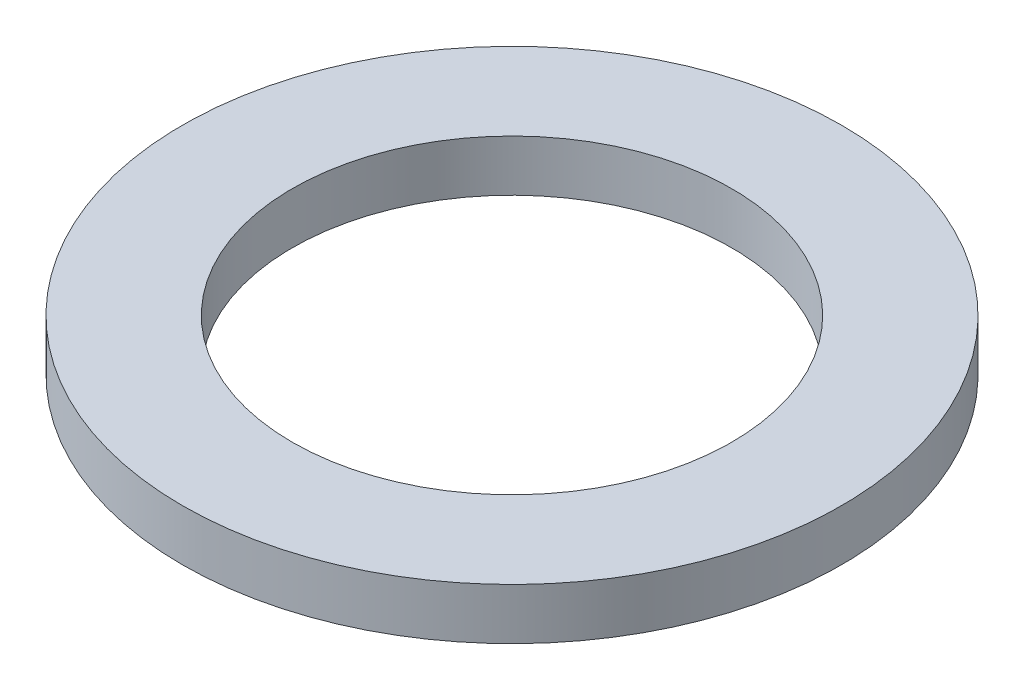
ISO-10303-21;
HEADER;
FILE_DESCRIPTION(('STEP AP214'),'2;1');
FILE_NAME('part.step','',(''),(''),'','','');
FILE_SCHEMA(('AUTOMOTIVE_DESIGN { 1 0 10303 214 1 1 1 1 }'));
ENDSEC;
DATA;
#1=APPLICATION_CONTEXT('core data for automotive mechanical design processes');
#2=APPLICATION_PROTOCOL_DEFINITION('international standard','automotive_design',2000,#1);
#3=PRODUCT_CONTEXT('',#1,'mechanical');
#4=PRODUCT('Part','Part','',(#3));
#5=PRODUCT_RELATED_PRODUCT_CATEGORY('part','',(#4));
#6=PRODUCT_DEFINITION_FORMATION('','',#4);
#7=PRODUCT_DEFINITION_CONTEXT('part definition',#1,'design');
#8=PRODUCT_DEFINITION('design','',#6,#7);
#9=PRODUCT_DEFINITION_SHAPE('','',#8);
#10=(LENGTH_UNIT() NAMED_UNIT(*) SI_UNIT(.MILLI.,.METRE.));
#11=(NAMED_UNIT(*) PLANE_ANGLE_UNIT() SI_UNIT($,.RADIAN.));
#12=(NAMED_UNIT(*) SI_UNIT($,.STERADIAN.) SOLID_ANGLE_UNIT());
#13=UNCERTAINTY_MEASURE_WITH_UNIT(LENGTH_MEASURE(1.E-05),#10,'distance_accuracy_value','');
#14=(GEOMETRIC_REPRESENTATION_CONTEXT(3) GLOBAL_UNCERTAINTY_ASSIGNED_CONTEXT((#13)) GLOBAL_UNIT_ASSIGNED_CONTEXT((#10,
#11,#12)) REPRESENTATION_CONTEXT('',''));
#15=CARTESIAN_POINT('',(0.,0.,0.));
#16=DIRECTION('',(0.,0.,1.));
#17=DIRECTION('',(1.,0.,0.));
#18=AXIS2_PLACEMENT_3D('',#15,#16,#17);
#19=CARTESIAN_POINT('',(0.,1.778,0.));
#20=DIRECTION('',(0.,1.,0.));
#21=DIRECTION('',(0.,0.,1.));
#22=AXIS2_PLACEMENT_3D('',#19,#20,#21);
#23=PLANE('',#22);
#24=CARTESIAN_POINT('',(0.,1.778,0.));
#25=DIRECTION('',(0.,1.,0.));
#26=DIRECTION('',(0.,0.,1.));
#27=AXIS2_PLACEMENT_3D('',#24,#25,#26);
#28=CIRCLE('',#27,11.43);
#29=CARTESIAN_POINT('',(0.,1.778,11.43));
#30=VERTEX_POINT('',#29);
#31=EDGE_CURVE('E10',#30,#30,#28,.T.);
#32=ORIENTED_EDGE('',*,*,#31,.T.);
#33=EDGE_LOOP('',(#32));
#34=FACE_BOUND('',#33,.T.);
#35=CARTESIAN_POINT('',(0.,1.778,0.));
#36=DIRECTION('',(0.,1.,0.));
#37=DIRECTION('',(0.,0.,1.));
#38=AXIS2_PLACEMENT_3D('',#35,#36,#37);
#39=CIRCLE('',#38,7.62);
#40=CARTESIAN_POINT('',(0.,1.778,7.62));
#41=VERTEX_POINT('',#40);
#42=EDGE_CURVE('E44',#41,#41,#39,.T.);
#43=ORIENTED_EDGE('',*,*,#42,.F.);
#44=EDGE_LOOP('',(#43));
#45=FACE_BOUND('',#44,.T.);
#46=ADVANCED_FACE('F33',(#34,#45),#23,.T.);
#47=CARTESIAN_POINT('',(0.,0.,0.));
#48=DIRECTION('',(0.,1.,0.));
#49=DIRECTION('',(0.,0.,1.));
#50=AXIS2_PLACEMENT_3D('',#47,#48,#49);
#51=PLANE('',#50);
#52=CARTESIAN_POINT('',(0.,0.,0.));
#53=DIRECTION('',(0.,1.,0.));
#54=DIRECTION('',(0.,0.,1.));
#55=AXIS2_PLACEMENT_3D('',#52,#53,#54);
#56=CIRCLE('',#55,11.43);
#57=CARTESIAN_POINT('',(0.,0.,11.43));
#58=VERTEX_POINT('',#57);
#59=EDGE_CURVE('E37',#58,#58,#56,.T.);
#60=ORIENTED_EDGE('',*,*,#59,.F.);
#61=EDGE_LOOP('',(#60));
#62=FACE_BOUND('',#61,.T.);
#63=CARTESIAN_POINT('',(0.,0.,0.));
#64=DIRECTION('',(0.,1.,0.));
#65=DIRECTION('',(0.,0.,1.));
#66=AXIS2_PLACEMENT_3D('',#63,#64,#65);
#67=CIRCLE('',#66,7.62);
#68=CARTESIAN_POINT('',(0.,0.,7.62));
#69=VERTEX_POINT('',#68);
#70=EDGE_CURVE('E46',#69,#69,#67,.T.);
#71=ORIENTED_EDGE('',*,*,#70,.T.);
#72=EDGE_LOOP('',(#71));
#73=FACE_BOUND('',#72,.T.);
#74=ADVANCED_FACE('F56',(#62,#73),#51,.F.);
#75=CARTESIAN_POINT('',(0.,1.778,0.));
#76=DIRECTION('',(0.,-1.,0.));
#77=DIRECTION('',(0.,0.,-1.));
#78=AXIS2_PLACEMENT_3D('',#75,#76,#77);
#79=CYLINDRICAL_SURFACE('',#78,11.43);
#80=ORIENTED_EDGE('',*,*,#31,.F.);
#81=EDGE_LOOP('',(#80));
#82=FACE_BOUND('',#81,.T.);
#83=ORIENTED_EDGE('',*,*,#59,.T.);
#84=EDGE_LOOP('',(#83));
#85=FACE_BOUND('',#84,.T.);
#86=ADVANCED_FACE('F35',(#82,#85),#79,.T.);
#87=CARTESIAN_POINT('',(0.,1.778,0.));
#88=DIRECTION('',(0.,-1.,0.));
#89=DIRECTION('',(0.,0.,-1.));
#90=AXIS2_PLACEMENT_3D('',#87,#88,#89);
#91=CYLINDRICAL_SURFACE('',#90,7.62);
#92=ORIENTED_EDGE('',*,*,#42,.T.);
#93=EDGE_LOOP('',(#92));
#94=FACE_BOUND('',#93,.T.);
#95=ORIENTED_EDGE('',*,*,#70,.F.);
#96=EDGE_LOOP('',(#95));
#97=FACE_BOUND('',#96,.T.);
#98=ADVANCED_FACE('F52',(#94,#97),#91,.F.);
#99=CLOSED_SHELL('',(#46,#74,#86,#98));
#100=MANIFOLD_SOLID_BREP('B2',#99);
#101=ADVANCED_BREP_SHAPE_REPRESENTATION('',(#18,#100),#14);
#102=SHAPE_DEFINITION_REPRESENTATION(#9,#101);
ENDSEC;
END-ISO-10303-21;
